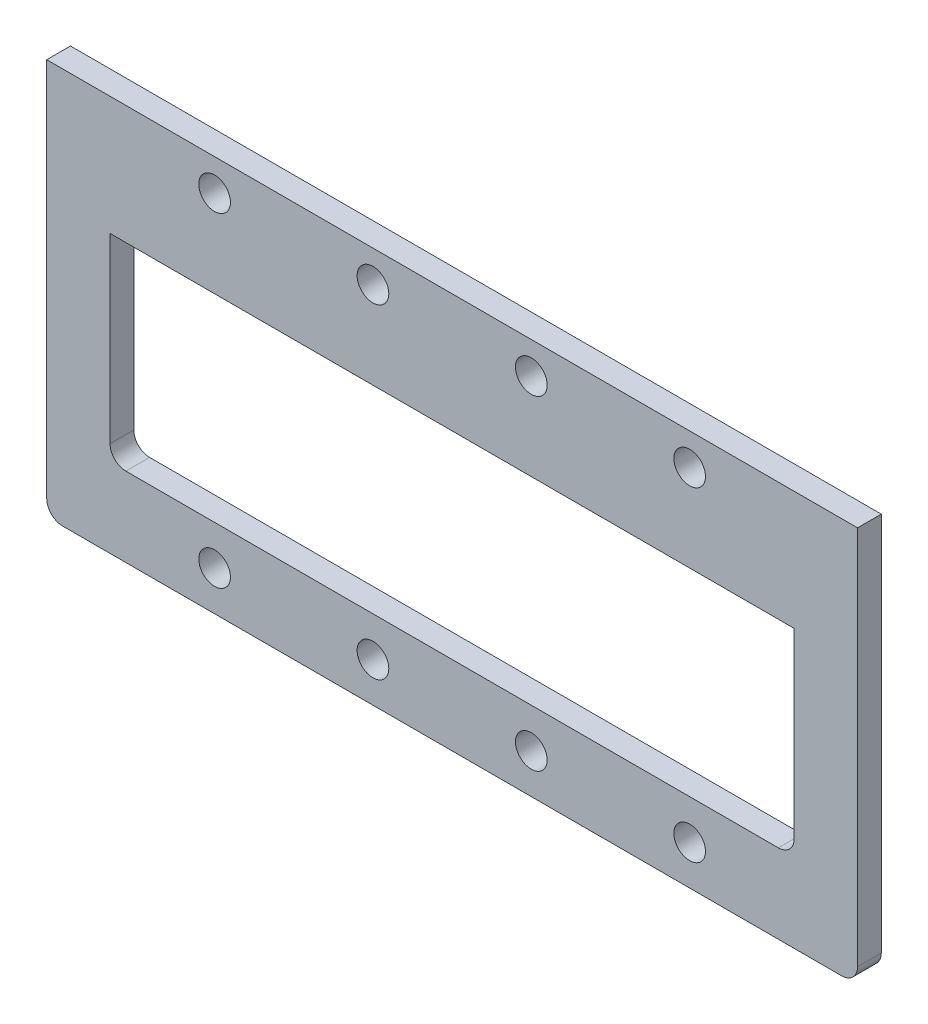
ISO-10303-21;
HEADER;
FILE_DESCRIPTION(('STEP AP214'),'2;1');
FILE_NAME('part.step','',(''),(''),'','','');
FILE_SCHEMA(('AUTOMOTIVE_DESIGN { 1 0 10303 214 1 1 1 1 }'));
ENDSEC;
DATA;
#1=APPLICATION_CONTEXT('core data for automotive mechanical design processes');
#2=APPLICATION_PROTOCOL_DEFINITION('international standard','automotive_design',2000,#1);
#3=PRODUCT_CONTEXT('',#1,'mechanical');
#4=PRODUCT('Part','Part','',(#3));
#5=PRODUCT_RELATED_PRODUCT_CATEGORY('part','',(#4));
#6=PRODUCT_DEFINITION_FORMATION('','',#4);
#7=PRODUCT_DEFINITION_CONTEXT('part definition',#1,'design');
#8=PRODUCT_DEFINITION('design','',#6,#7);
#9=PRODUCT_DEFINITION_SHAPE('','',#8);
#10=(LENGTH_UNIT() NAMED_UNIT(*) SI_UNIT(.MILLI.,.METRE.));
#11=(NAMED_UNIT(*) PLANE_ANGLE_UNIT() SI_UNIT($,.RADIAN.));
#12=(NAMED_UNIT(*) SI_UNIT($,.STERADIAN.) SOLID_ANGLE_UNIT());
#13=UNCERTAINTY_MEASURE_WITH_UNIT(LENGTH_MEASURE(1.E-05),#10,'distance_accuracy_value','');
#14=(GEOMETRIC_REPRESENTATION_CONTEXT(3) GLOBAL_UNCERTAINTY_ASSIGNED_CONTEXT((#13)) GLOBAL_UNIT_ASSIGNED_CONTEXT((#10,
#11,#12)) REPRESENTATION_CONTEXT('',''));
#15=CARTESIAN_POINT('',(0.,0.,0.));
#16=DIRECTION('',(0.,0.,1.));
#17=DIRECTION('',(1.,0.,0.));
#18=AXIS2_PLACEMENT_3D('',#15,#16,#17);
#19=CARTESIAN_POINT('',(0.,0.,3.));
#20=DIRECTION('',(0.,0.,1.));
#21=DIRECTION('',(1.,0.,0.));
#22=AXIS2_PLACEMENT_3D('',#19,#20,#21);
#23=PLANE('',#22);
#24=CARTESIAN_POINT('',(10.5636615811373,20.1545076282941,3.));
#25=DIRECTION('',(0.,0.,1.));
#26=DIRECTION('',(1.,0.,0.));
#27=AXIS2_PLACEMENT_3D('',#24,#25,#26);
#28=CIRCLE('',#27,2.);
#29=CARTESIAN_POINT('',(12.5636615811373,20.1545076282941,3.));
#30=VERTEX_POINT('',#29);
#31=EDGE_CURVE('E157',#30,#30,#28,.T.);
#32=ORIENTED_EDGE('',*,*,#31,.F.);
#33=EDGE_LOOP('',(#32));
#34=FACE_BOUND('',#33,.T.);
#35=CARTESIAN_POINT('',(-9.43633841886271,-20.845492371706,3.));
#36=DIRECTION('',(0.,0.,1.));
#37=DIRECTION('',(1.,0.,0.));
#38=AXIS2_PLACEMENT_3D('',#35,#36,#37);
#39=CIRCLE('',#38,2.);
#40=CARTESIAN_POINT('',(-7.43633841886271,-20.845492371706,3.));
#41=VERTEX_POINT('',#40);
#42=EDGE_CURVE('E237',#41,#41,#39,.T.);
#43=ORIENTED_EDGE('',*,*,#42,.F.);
#44=EDGE_LOOP('',(#43));
#45=FACE_BOUND('',#44,.T.);
#46=CARTESIAN_POINT('',(-9.43633841886271,20.1545076282941,3.));
#47=DIRECTION('',(0.,0.,1.));
#48=DIRECTION('',(1.,0.,0.));
#49=AXIS2_PLACEMENT_3D('',#46,#47,#48);
#50=CIRCLE('',#49,2.);
#51=CARTESIAN_POINT('',(-7.43633841886271,20.1545076282941,3.));
#52=VERTEX_POINT('',#51);
#53=EDGE_CURVE('E240',#52,#52,#50,.T.);
#54=ORIENTED_EDGE('',*,*,#53,.F.);
#55=EDGE_LOOP('',(#54));
#56=FACE_BOUND('',#55,.T.);
#57=CARTESIAN_POINT('',(-29.4363384188627,-20.845492371706,3.));
#58=DIRECTION('',(0.,0.,1.));
#59=DIRECTION('',(1.,0.,0.));
#60=AXIS2_PLACEMENT_3D('',#57,#58,#59);
#61=CIRCLE('',#60,2.);
#62=CARTESIAN_POINT('',(-27.4363384188627,-20.845492371706,3.));
#63=VERTEX_POINT('',#62);
#64=EDGE_CURVE('E243',#63,#63,#61,.T.);
#65=ORIENTED_EDGE('',*,*,#64,.F.);
#66=EDGE_LOOP('',(#65));
#67=FACE_BOUND('',#66,.T.);
#68=CARTESIAN_POINT('',(30.5636615811373,-20.845492371706,3.));
#69=DIRECTION('',(0.,0.,1.));
#70=DIRECTION('',(1.,0.,0.));
#71=AXIS2_PLACEMENT_3D('',#68,#69,#70);
#72=CIRCLE('',#71,2.);
#73=CARTESIAN_POINT('',(32.5636615811373,-20.845492371706,3.));
#74=VERTEX_POINT('',#73);
#75=EDGE_CURVE('E246',#74,#74,#72,.T.);
#76=ORIENTED_EDGE('',*,*,#75,.F.);
#77=EDGE_LOOP('',(#76));
#78=FACE_BOUND('',#77,.T.);
#79=CARTESIAN_POINT('',(30.5636615811373,20.1545076282941,3.));
#80=DIRECTION('',(0.,0.,1.));
#81=DIRECTION('',(1.,0.,0.));
#82=AXIS2_PLACEMENT_3D('',#79,#80,#81);
#83=CIRCLE('',#82,2.);
#84=CARTESIAN_POINT('',(32.5636615811373,20.1545076282941,3.));
#85=VERTEX_POINT('',#84);
#86=EDGE_CURVE('E249',#85,#85,#83,.T.);
#87=ORIENTED_EDGE('',*,*,#86,.F.);
#88=EDGE_LOOP('',(#87));
#89=FACE_BOUND('',#88,.T.);
#90=CARTESIAN_POINT('',(10.5636615811373,-20.845492371706,3.));
#91=DIRECTION('',(0.,0.,1.));
#92=DIRECTION('',(1.,0.,0.));
#93=AXIS2_PLACEMENT_3D('',#90,#91,#92);
#94=CIRCLE('',#93,2.);
#95=CARTESIAN_POINT('',(12.5636615811373,-20.845492371706,3.));
#96=VERTEX_POINT('',#95);
#97=EDGE_CURVE('E252',#96,#96,#94,.T.);
#98=ORIENTED_EDGE('',*,*,#97,.F.);
#99=EDGE_LOOP('',(#98));
#100=FACE_BOUND('',#99,.T.);
#101=CARTESIAN_POINT('',(-29.4363384188627,20.1545076282941,3.));
#102=DIRECTION('',(0.,0.,1.));
#103=DIRECTION('',(1.,0.,0.));
#104=AXIS2_PLACEMENT_3D('',#101,#102,#103);
#105=CIRCLE('',#104,2.);
#106=CARTESIAN_POINT('',(-27.4363384188627,20.1545076282941,3.));
#107=VERTEX_POINT('',#106);
#108=EDGE_CURVE('E255',#107,#107,#105,.T.);
#109=ORIENTED_EDGE('',*,*,#108,.F.);
#110=EDGE_LOOP('',(#109));
#111=FACE_BOUND('',#110,.T.);
#112=DIRECTION('',(0.,-1.,0.));
#113=VECTOR('',#112,1.);
#114=CARTESIAN_POINT('',(-50.6363384188627,24.154507628294,3.));
#115=LINE('',#114,#113);
#116=CARTESIAN_POINT('',(-50.6363384188627,24.154507628294,3.));
#117=VERTEX_POINT('',#116);
#118=CARTESIAN_POINT('',(-50.6363384188627,-23.845492371706,3.));
#119=VERTEX_POINT('',#118);
#120=EDGE_CURVE('E167',#117,#119,#115,.T.);
#121=ORIENTED_EDGE('',*,*,#120,.T.);
#122=CARTESIAN_POINT('',(-48.6363384188627,-23.845492371706,3.));
#123=DIRECTION('',(0.,0.,1.));
#124=DIRECTION('',(1.,0.,0.));
#125=AXIS2_PLACEMENT_3D('',#122,#123,#124);
#126=CIRCLE('',#125,2.);
#127=CARTESIAN_POINT('',(-48.6363384188627,-25.845492371706,3.));
#128=VERTEX_POINT('',#127);
#129=EDGE_CURVE('E208',#119,#128,#126,.T.);
#130=ORIENTED_EDGE('',*,*,#129,.T.);
#131=DIRECTION('',(1.,0.,0.));
#132=VECTOR('',#131,1.);
#133=CARTESIAN_POINT('',(-50.6363384188627,-25.845492371706,3.));
#134=LINE('',#133,#132);
#135=CARTESIAN_POINT('',(49.7636615811375,-25.845492371706,3.));
#136=VERTEX_POINT('',#135);
#137=EDGE_CURVE('E170',#128,#136,#134,.T.);
#138=ORIENTED_EDGE('',*,*,#137,.T.);
#139=CARTESIAN_POINT('',(49.7636615811375,-23.845492371706,3.));
#140=DIRECTION('',(0.,0.,1.));
#141=DIRECTION('',(1.,0.,0.));
#142=AXIS2_PLACEMENT_3D('',#139,#140,#141);
#143=CIRCLE('',#142,2.);
#144=CARTESIAN_POINT('',(51.7636615811373,-23.845492371706,3.));
#145=VERTEX_POINT('',#144);
#146=EDGE_CURVE('E49',#136,#145,#143,.T.);
#147=ORIENTED_EDGE('',*,*,#146,.T.);
#148=DIRECTION('',(0.,1.,0.));
#149=VECTOR('',#148,1.);
#150=CARTESIAN_POINT('',(51.7636615811373,-25.845492371706,3.));
#151=LINE('',#150,#149);
#152=CARTESIAN_POINT('',(51.7636615811373,24.1545076282941,3.));
#153=VERTEX_POINT('',#152);
#154=EDGE_CURVE('E172',#145,#153,#151,.T.);
#155=ORIENTED_EDGE('',*,*,#154,.T.);
#156=DIRECTION('',(-1.,0.,0.));
#157=VECTOR('',#156,1.);
#158=CARTESIAN_POINT('',(51.7636615811373,24.1545076282941,3.));
#159=LINE('',#158,#157);
#160=EDGE_CURVE('E164',#153,#117,#159,.T.);
#161=ORIENTED_EDGE('',*,*,#160,.T.);
#162=EDGE_LOOP('',(#121,#130,#138,#147,#155,#161));
#163=FACE_BOUND('',#162,.T.);
#164=DIRECTION('',(0.,1.,0.));
#165=VECTOR('',#164,1.);
#166=CARTESIAN_POINT('',(43.7636615811373,-15.845492371706,3.));
#167=LINE('',#166,#165);
#168=CARTESIAN_POINT('',(43.7636615811373,-13.845492371706,3.));
#169=VERTEX_POINT('',#168);
#170=CARTESIAN_POINT('',(43.7636615811373,9.15450762829408,3.));
#171=VERTEX_POINT('',#170);
#172=EDGE_CURVE('E124',#169,#171,#167,.T.);
#173=ORIENTED_EDGE('',*,*,#172,.F.);
#174=CARTESIAN_POINT('',(41.7636615811373,-13.845492371706,3.));
#175=DIRECTION('',(0.,0.,1.));
#176=DIRECTION('',(1.,0.,0.));
#177=AXIS2_PLACEMENT_3D('',#174,#175,#176);
#178=CIRCLE('',#177,2.);
#179=CARTESIAN_POINT('',(41.7636615811373,-15.845492371706,3.));
#180=VERTEX_POINT('',#179);
#181=EDGE_CURVE('E215',#169,#180,#178,.F.);
#182=ORIENTED_EDGE('',*,*,#181,.T.);
#183=DIRECTION('',(1.,0.,0.));
#184=VECTOR('',#183,1.);
#185=CARTESIAN_POINT('',(-42.6363384188627,-15.845492371706,3.));
#186=LINE('',#185,#184);
#187=CARTESIAN_POINT('',(-40.6363384188627,-15.845492371706,3.));
#188=VERTEX_POINT('',#187);
#189=EDGE_CURVE('E136',#188,#180,#186,.T.);
#190=ORIENTED_EDGE('',*,*,#189,.F.);
#191=CARTESIAN_POINT('',(-40.6363384188627,-13.845492371706,3.));
#192=DIRECTION('',(0.,0.,1.));
#193=DIRECTION('',(1.,0.,0.));
#194=AXIS2_PLACEMENT_3D('',#191,#192,#193);
#195=CIRCLE('',#194,2.);
#196=CARTESIAN_POINT('',(-42.6363384188627,-13.845492371706,3.));
#197=VERTEX_POINT('',#196);
#198=EDGE_CURVE('E11',#188,#197,#195,.F.);
#199=ORIENTED_EDGE('',*,*,#198,.T.);
#200=DIRECTION('',(0.,-1.,0.));
#201=VECTOR('',#200,1.);
#202=CARTESIAN_POINT('',(-42.6363384188627,9.15450762829408,3.));
#203=LINE('',#202,#201);
#204=CARTESIAN_POINT('',(-42.6363384188627,9.15450762829408,3.));
#205=VERTEX_POINT('',#204);
#206=EDGE_CURVE('E148',#205,#197,#203,.T.);
#207=ORIENTED_EDGE('',*,*,#206,.F.);
#208=DIRECTION('',(-1.,0.,0.));
#209=VECTOR('',#208,1.);
#210=CARTESIAN_POINT('',(43.7636615811373,9.15450762829408,3.));
#211=LINE('',#210,#209);
#212=EDGE_CURVE('E135',#171,#205,#211,.T.);
#213=ORIENTED_EDGE('',*,*,#212,.F.);
#214=EDGE_LOOP('',(#173,#182,#190,#199,#207,#213));
#215=FACE_BOUND('',#214,.T.);
#216=ADVANCED_FACE('F34',(#34,#45,#56,#67,#78,#89,#100,#111,#163,#215),#23,.T.);
#217=CARTESIAN_POINT('',(0.,0.,0.));
#218=DIRECTION('',(0.,0.,1.));
#219=DIRECTION('',(1.,0.,0.));
#220=AXIS2_PLACEMENT_3D('',#217,#218,#219);
#221=PLANE('',#220);
#222=CARTESIAN_POINT('',(10.5636615811373,20.1545076282941,0.));
#223=DIRECTION('',(0.,0.,1.));
#224=DIRECTION('',(1.,0.,0.));
#225=AXIS2_PLACEMENT_3D('',#222,#223,#224);
#226=CIRCLE('',#225,2.);
#227=CARTESIAN_POINT('',(12.5636615811373,20.1545076282941,0.));
#228=VERTEX_POINT('',#227);
#229=EDGE_CURVE('E268',#228,#228,#226,.T.);
#230=ORIENTED_EDGE('',*,*,#229,.T.);
#231=EDGE_LOOP('',(#230));
#232=FACE_BOUND('',#231,.T.);
#233=CARTESIAN_POINT('',(-9.43633841886271,-20.845492371706,0.));
#234=DIRECTION('',(0.,0.,1.));
#235=DIRECTION('',(1.,0.,0.));
#236=AXIS2_PLACEMENT_3D('',#233,#234,#235);
#237=CIRCLE('',#236,2.);
#238=CARTESIAN_POINT('',(-7.43633841886271,-20.845492371706,0.));
#239=VERTEX_POINT('',#238);
#240=EDGE_CURVE('E265',#239,#239,#237,.T.);
#241=ORIENTED_EDGE('',*,*,#240,.T.);
#242=EDGE_LOOP('',(#241));
#243=FACE_BOUND('',#242,.T.);
#244=CARTESIAN_POINT('',(-9.43633841886271,20.1545076282941,0.));
#245=DIRECTION('',(0.,0.,1.));
#246=DIRECTION('',(1.,0.,0.));
#247=AXIS2_PLACEMENT_3D('',#244,#245,#246);
#248=CIRCLE('',#247,2.);
#249=CARTESIAN_POINT('',(-7.43633841886271,20.1545076282941,0.));
#250=VERTEX_POINT('',#249);
#251=EDGE_CURVE('E262',#250,#250,#248,.T.);
#252=ORIENTED_EDGE('',*,*,#251,.T.);
#253=EDGE_LOOP('',(#252));
#254=FACE_BOUND('',#253,.T.);
#255=CARTESIAN_POINT('',(-29.4363384188627,-20.845492371706,0.));
#256=DIRECTION('',(0.,0.,1.));
#257=DIRECTION('',(1.,0.,0.));
#258=AXIS2_PLACEMENT_3D('',#255,#256,#257);
#259=CIRCLE('',#258,2.);
#260=CARTESIAN_POINT('',(-27.4363384188627,-20.845492371706,0.));
#261=VERTEX_POINT('',#260);
#262=EDGE_CURVE('E261',#261,#261,#259,.T.);
#263=ORIENTED_EDGE('',*,*,#262,.T.);
#264=EDGE_LOOP('',(#263));
#265=FACE_BOUND('',#264,.T.);
#266=CARTESIAN_POINT('',(30.5636615811373,-20.845492371706,0.));
#267=DIRECTION('',(0.,0.,1.));
#268=DIRECTION('',(1.,0.,0.));
#269=AXIS2_PLACEMENT_3D('',#266,#267,#268);
#270=CIRCLE('',#269,2.);
#271=CARTESIAN_POINT('',(32.5636615811373,-20.845492371706,0.));
#272=VERTEX_POINT('',#271);
#273=EDGE_CURVE('E277',#272,#272,#270,.T.);
#274=ORIENTED_EDGE('',*,*,#273,.T.);
#275=EDGE_LOOP('',(#274));
#276=FACE_BOUND('',#275,.T.);
#277=CARTESIAN_POINT('',(30.5636615811373,20.1545076282941,0.));
#278=DIRECTION('',(0.,0.,1.));
#279=DIRECTION('',(1.,0.,0.));
#280=AXIS2_PLACEMENT_3D('',#277,#278,#279);
#281=CIRCLE('',#280,2.);
#282=CARTESIAN_POINT('',(32.5636615811373,20.1545076282941,0.));
#283=VERTEX_POINT('',#282);
#284=EDGE_CURVE('E274',#283,#283,#281,.T.);
#285=ORIENTED_EDGE('',*,*,#284,.T.);
#286=EDGE_LOOP('',(#285));
#287=FACE_BOUND('',#286,.T.);
#288=CARTESIAN_POINT('',(10.5636615811373,-20.845492371706,0.));
#289=DIRECTION('',(0.,0.,1.));
#290=DIRECTION('',(1.,0.,0.));
#291=AXIS2_PLACEMENT_3D('',#288,#289,#290);
#292=CIRCLE('',#291,2.);
#293=CARTESIAN_POINT('',(12.5636615811373,-20.845492371706,0.));
#294=VERTEX_POINT('',#293);
#295=EDGE_CURVE('E271',#294,#294,#292,.T.);
#296=ORIENTED_EDGE('',*,*,#295,.T.);
#297=EDGE_LOOP('',(#296));
#298=FACE_BOUND('',#297,.T.);
#299=CARTESIAN_POINT('',(-29.4363384188627,20.1545076282941,0.));
#300=DIRECTION('',(0.,0.,1.));
#301=DIRECTION('',(1.,0.,0.));
#302=AXIS2_PLACEMENT_3D('',#299,#300,#301);
#303=CIRCLE('',#302,2.);
#304=CARTESIAN_POINT('',(-27.4363384188627,20.1545076282941,0.));
#305=VERTEX_POINT('',#304);
#306=EDGE_CURVE('E258',#305,#305,#303,.T.);
#307=ORIENTED_EDGE('',*,*,#306,.T.);
#308=EDGE_LOOP('',(#307));
#309=FACE_BOUND('',#308,.T.);
#310=DIRECTION('',(1.,0.,0.));
#311=VECTOR('',#310,1.);
#312=CARTESIAN_POINT('',(-50.6363384188627,-25.845492371706,0.));
#313=LINE('',#312,#311);
#314=CARTESIAN_POINT('',(-48.6363384188627,-25.845492371706,0.));
#315=VERTEX_POINT('',#314);
#316=CARTESIAN_POINT('',(49.7636615811375,-25.845492371706,0.));
#317=VERTEX_POINT('',#316);
#318=EDGE_CURVE('E179',#315,#317,#313,.T.);
#319=ORIENTED_EDGE('',*,*,#318,.F.);
#320=CARTESIAN_POINT('',(-48.6363384188627,-23.845492371706,0.));
#321=DIRECTION('',(0.,0.,1.));
#322=DIRECTION('',(1.,0.,0.));
#323=AXIS2_PLACEMENT_3D('',#320,#321,#322);
#324=CIRCLE('',#323,2.);
#325=CARTESIAN_POINT('',(-50.6363384188627,-23.845492371706,0.));
#326=VERTEX_POINT('',#325);
#327=EDGE_CURVE('E204',#315,#326,#324,.F.);
#328=ORIENTED_EDGE('',*,*,#327,.T.);
#329=DIRECTION('',(0.,-1.,0.));
#330=VECTOR('',#329,1.);
#331=CARTESIAN_POINT('',(-50.6363384188627,16.1545076282941,0.));
#332=LINE('',#331,#330);
#333=CARTESIAN_POINT('',(-50.6363384188627,24.154507628294,0.));
#334=VERTEX_POINT('',#333);
#335=EDGE_CURVE('E177',#334,#326,#332,.T.);
#336=ORIENTED_EDGE('',*,*,#335,.F.);
#337=DIRECTION('',(-1.,0.,0.));
#338=VECTOR('',#337,1.);
#339=CARTESIAN_POINT('',(51.7636615811373,24.1545076282941,0.));
#340=LINE('',#339,#338);
#341=CARTESIAN_POINT('',(51.7636615811373,24.1545076282941,0.));
#342=VERTEX_POINT('',#341);
#343=EDGE_CURVE('E144',#342,#334,#340,.T.);
#344=ORIENTED_EDGE('',*,*,#343,.F.);
#345=DIRECTION('',(0.,1.,0.));
#346=VECTOR('',#345,1.);
#347=CARTESIAN_POINT('',(51.7636615811373,18.1545076282941,0.));
#348=LINE('',#347,#346);
#349=CARTESIAN_POINT('',(51.7636615811375,-23.845492371706,0.));
#350=VERTEX_POINT('',#349);
#351=EDGE_CURVE('E168',#350,#342,#348,.T.);
#352=ORIENTED_EDGE('',*,*,#351,.F.);
#353=CARTESIAN_POINT('',(49.7636615811375,-23.845492371706,0.));
#354=DIRECTION('',(0.,0.,1.));
#355=DIRECTION('',(1.,0.,0.));
#356=AXIS2_PLACEMENT_3D('',#353,#354,#355);
#357=CIRCLE('',#356,2.);
#358=EDGE_CURVE('E202',#350,#317,#357,.F.);
#359=ORIENTED_EDGE('',*,*,#358,.T.);
#360=EDGE_LOOP('',(#319,#328,#336,#344,#352,#359));
#361=FACE_BOUND('',#360,.T.);
#362=DIRECTION('',(0.,-1.,0.));
#363=VECTOR('',#362,1.);
#364=CARTESIAN_POINT('',(-42.6363384188627,9.15450762829408,0.));
#365=LINE('',#364,#363);
#366=CARTESIAN_POINT('',(-42.6363384188627,9.15450762829408,0.));
#367=VERTEX_POINT('',#366);
#368=CARTESIAN_POINT('',(-42.6363384188627,-13.845492371706,0.));
#369=VERTEX_POINT('',#368);
#370=EDGE_CURVE('E160',#367,#369,#365,.T.);
#371=ORIENTED_EDGE('',*,*,#370,.T.);
#372=CARTESIAN_POINT('',(-40.6363384188627,-13.845492371706,0.));
#373=DIRECTION('',(0.,0.,1.));
#374=DIRECTION('',(1.,0.,0.));
#375=AXIS2_PLACEMENT_3D('',#372,#373,#374);
#376=CIRCLE('',#375,2.);
#377=CARTESIAN_POINT('',(-40.6363384188627,-15.845492371706,0.));
#378=VERTEX_POINT('',#377);
#379=EDGE_CURVE('E42',#369,#378,#376,.T.);
#380=ORIENTED_EDGE('',*,*,#379,.T.);
#381=DIRECTION('',(1.,0.,0.));
#382=VECTOR('',#381,1.);
#383=CARTESIAN_POINT('',(-42.6363384188627,-15.845492371706,0.));
#384=LINE('',#383,#382);
#385=CARTESIAN_POINT('',(41.7636615811373,-15.845492371706,0.));
#386=VERTEX_POINT('',#385);
#387=EDGE_CURVE('E153',#378,#386,#384,.T.);
#388=ORIENTED_EDGE('',*,*,#387,.T.);
#389=CARTESIAN_POINT('',(41.7636615811373,-13.845492371706,0.));
#390=DIRECTION('',(0.,0.,1.));
#391=DIRECTION('',(1.,0.,0.));
#392=AXIS2_PLACEMENT_3D('',#389,#390,#391);
#393=CIRCLE('',#392,2.);
#394=CARTESIAN_POINT('',(43.7636615811373,-13.845492371706,0.));
#395=VERTEX_POINT('',#394);
#396=EDGE_CURVE('E213',#386,#395,#393,.T.);
#397=ORIENTED_EDGE('',*,*,#396,.T.);
#398=DIRECTION('',(0.,1.,0.));
#399=VECTOR('',#398,1.);
#400=CARTESIAN_POINT('',(43.7636615811373,-15.845492371706,0.));
#401=LINE('',#400,#399);
#402=CARTESIAN_POINT('',(43.7636615811373,9.15450762829408,0.));
#403=VERTEX_POINT('',#402);
#404=EDGE_CURVE('E156',#395,#403,#401,.T.);
#405=ORIENTED_EDGE('',*,*,#404,.T.);
#406=DIRECTION('',(-1.,0.,0.));
#407=VECTOR('',#406,1.);
#408=CARTESIAN_POINT('',(43.7636615811373,9.15450762829408,0.));
#409=LINE('',#408,#407);
#410=EDGE_CURVE('E143',#403,#367,#409,.T.);
#411=ORIENTED_EDGE('',*,*,#410,.T.);
#412=EDGE_LOOP('',(#371,#380,#388,#397,#405,#411));
#413=FACE_BOUND('',#412,.T.);
#414=ADVANCED_FACE('F218',(#232,#243,#254,#265,#276,#287,#298,#309,#361,#413),#221,.F.);
#415=CARTESIAN_POINT('',(51.7636615811373,24.1545076282941,3.));
#416=DIRECTION('',(0.,-1.,0.));
#417=DIRECTION('',(1.,0.,0.));
#418=AXIS2_PLACEMENT_3D('',#415,#416,#417);
#419=PLANE('',#418);
#420=ORIENTED_EDGE('',*,*,#343,.T.);
#421=DIRECTION('',(0.,0.,-1.));
#422=VECTOR('',#421,1.);
#423=CARTESIAN_POINT('',(-50.6363384188627,24.154507628294,3.));
#424=LINE('',#423,#422);
#425=EDGE_CURVE('E185',#117,#334,#424,.T.);
#426=ORIENTED_EDGE('',*,*,#425,.F.);
#427=ORIENTED_EDGE('',*,*,#160,.F.);
#428=DIRECTION('',(0.,0.,-1.));
#429=VECTOR('',#428,1.);
#430=CARTESIAN_POINT('',(51.7636615811373,24.1545076282941,3.));
#431=LINE('',#430,#429);
#432=EDGE_CURVE('E174',#153,#342,#431,.T.);
#433=ORIENTED_EDGE('',*,*,#432,.T.);
#434=EDGE_LOOP('',(#420,#426,#427,#433));
#435=FACE_BOUND('',#434,.T.);
#436=ADVANCED_FACE('F308',(#435),#419,.F.);
#437=CARTESIAN_POINT('',(-50.6363384188627,16.1545076282941,3.));
#438=DIRECTION('',(1.,0.,0.));
#439=DIRECTION('',(0.,0.,-1.));
#440=AXIS2_PLACEMENT_3D('',#437,#438,#439);
#441=PLANE('',#440);
#442=ORIENTED_EDGE('',*,*,#335,.T.);
#443=DIRECTION('',(0.,0.,-1.));
#444=VECTOR('',#443,1.);
#445=CARTESIAN_POINT('',(-50.6363384188627,-23.845492371706,3.));
#446=LINE('',#445,#444);
#447=EDGE_CURVE('E57',#326,#119,#446,.F.);
#448=ORIENTED_EDGE('',*,*,#447,.T.);
#449=ORIENTED_EDGE('',*,*,#120,.F.);
#450=ORIENTED_EDGE('',*,*,#425,.T.);
#451=EDGE_LOOP('',(#442,#448,#449,#450));
#452=FACE_BOUND('',#451,.T.);
#453=ADVANCED_FACE('F323',(#452),#441,.F.);
#454=CARTESIAN_POINT('',(-50.6363384188627,-25.845492371706,3.));
#455=DIRECTION('',(0.,1.,0.));
#456=DIRECTION('',(0.,0.,1.));
#457=AXIS2_PLACEMENT_3D('',#454,#455,#456);
#458=PLANE('',#457);
#459=ORIENTED_EDGE('',*,*,#137,.F.);
#460=DIRECTION('',(0.,0.,-1.));
#461=VECTOR('',#460,1.);
#462=CARTESIAN_POINT('',(-48.6363384188627,-25.845492371706,3.));
#463=LINE('',#462,#461);
#464=EDGE_CURVE('E199',#128,#315,#463,.T.);
#465=ORIENTED_EDGE('',*,*,#464,.T.);
#466=ORIENTED_EDGE('',*,*,#318,.T.);
#467=DIRECTION('',(0.,0.,-1.));
#468=VECTOR('',#467,1.);
#469=CARTESIAN_POINT('',(49.7636615811375,-25.845492371706,3.));
#470=LINE('',#469,#468);
#471=EDGE_CURVE('E197',#317,#136,#470,.F.);
#472=ORIENTED_EDGE('',*,*,#471,.T.);
#473=EDGE_LOOP('',(#459,#465,#466,#472));
#474=FACE_BOUND('',#473,.T.);
#475=ADVANCED_FACE('F319',(#474),#458,.F.);
#476=CARTESIAN_POINT('',(51.7636615811373,18.1545076282941,3.));
#477=DIRECTION('',(-1.,0.,0.));
#478=DIRECTION('',(0.,-1.,0.));
#479=AXIS2_PLACEMENT_3D('',#476,#477,#478);
#480=PLANE('',#479);
#481=ORIENTED_EDGE('',*,*,#154,.F.);
#482=DIRECTION('',(0.,0.,-1.));
#483=VECTOR('',#482,1.);
#484=CARTESIAN_POINT('',(51.7636615811375,-23.845492371706,3.));
#485=LINE('',#484,#483);
#486=EDGE_CURVE('E210',#145,#350,#485,.T.);
#487=ORIENTED_EDGE('',*,*,#486,.T.);
#488=ORIENTED_EDGE('',*,*,#351,.T.);
#489=ORIENTED_EDGE('',*,*,#432,.F.);
#490=EDGE_LOOP('',(#481,#487,#488,#489));
#491=FACE_BOUND('',#490,.T.);
#492=ADVANCED_FACE('F316',(#491),#480,.F.);
#493=CARTESIAN_POINT('',(-42.6363384188627,-15.845492371706,3.));
#494=DIRECTION('',(0.,1.,0.));
#495=DIRECTION('',(0.,0.,1.));
#496=AXIS2_PLACEMENT_3D('',#493,#494,#495);
#497=PLANE('',#496);
#498=ORIENTED_EDGE('',*,*,#189,.T.);
#499=DIRECTION('',(0.,0.,-1.));
#500=VECTOR('',#499,1.);
#501=CARTESIAN_POINT('',(41.7636615811373,-15.845492371706,0.));
#502=LINE('',#501,#500);
#503=EDGE_CURVE('E190',#180,#386,#502,.T.);
#504=ORIENTED_EDGE('',*,*,#503,.T.);
#505=ORIENTED_EDGE('',*,*,#387,.F.);
#506=DIRECTION('',(0.,0.,-1.));
#507=VECTOR('',#506,1.);
#508=CARTESIAN_POINT('',(-40.6363384188627,-15.845492371706,3.));
#509=LINE('',#508,#507);
#510=EDGE_CURVE('E188',#378,#188,#509,.F.);
#511=ORIENTED_EDGE('',*,*,#510,.T.);
#512=EDGE_LOOP('',(#498,#504,#505,#511));
#513=FACE_BOUND('',#512,.T.);
#514=ADVANCED_FACE('F225',(#513),#497,.T.);
#515=CARTESIAN_POINT('',(43.7636615811373,-15.845492371706,3.));
#516=DIRECTION('',(-1.,0.,0.));
#517=DIRECTION('',(0.,-1.,0.));
#518=AXIS2_PLACEMENT_3D('',#515,#516,#517);
#519=PLANE('',#518);
#520=ORIENTED_EDGE('',*,*,#404,.F.);
#521=DIRECTION('',(0.,0.,-1.));
#522=VECTOR('',#521,1.);
#523=CARTESIAN_POINT('',(43.7636615811373,-13.845492371706,3.));
#524=LINE('',#523,#522);
#525=EDGE_CURVE('E131',#395,#169,#524,.F.);
#526=ORIENTED_EDGE('',*,*,#525,.T.);
#527=ORIENTED_EDGE('',*,*,#172,.T.);
#528=DIRECTION('',(0.,0.,-1.));
#529=VECTOR('',#528,1.);
#530=CARTESIAN_POINT('',(43.7636615811373,9.15450762829408,3.));
#531=LINE('',#530,#529);
#532=EDGE_CURVE('E128',#171,#403,#531,.T.);
#533=ORIENTED_EDGE('',*,*,#532,.T.);
#534=EDGE_LOOP('',(#520,#526,#527,#533));
#535=FACE_BOUND('',#534,.T.);
#536=ADVANCED_FACE('F127',(#535),#519,.T.);
#537=CARTESIAN_POINT('',(43.7636615811373,9.15450762829408,3.));
#538=DIRECTION('',(0.,-1.,0.));
#539=DIRECTION('',(0.,0.,-1.));
#540=AXIS2_PLACEMENT_3D('',#537,#538,#539);
#541=PLANE('',#540);
#542=ORIENTED_EDGE('',*,*,#410,.F.);
#543=ORIENTED_EDGE('',*,*,#532,.F.);
#544=ORIENTED_EDGE('',*,*,#212,.T.);
#545=DIRECTION('',(0.,0.,-1.));
#546=VECTOR('',#545,1.);
#547=CARTESIAN_POINT('',(-42.6363384188627,9.15450762829408,3.));
#548=LINE('',#547,#546);
#549=EDGE_CURVE('E145',#205,#367,#548,.T.);
#550=ORIENTED_EDGE('',*,*,#549,.T.);
#551=EDGE_LOOP('',(#542,#543,#544,#550));
#552=FACE_BOUND('',#551,.T.);
#553=ADVANCED_FACE('F140',(#552),#541,.T.);
#554=CARTESIAN_POINT('',(-42.6363384188627,9.15450762829408,3.));
#555=DIRECTION('',(1.,0.,0.));
#556=DIRECTION('',(0.,0.,-1.));
#557=AXIS2_PLACEMENT_3D('',#554,#555,#556);
#558=PLANE('',#557);
#559=ORIENTED_EDGE('',*,*,#206,.T.);
#560=DIRECTION('',(0.,0.,-1.));
#561=VECTOR('',#560,1.);
#562=CARTESIAN_POINT('',(-42.6363384188627,-13.845492371706,0.));
#563=LINE('',#562,#561);
#564=EDGE_CURVE('E194',#197,#369,#563,.T.);
#565=ORIENTED_EDGE('',*,*,#564,.T.);
#566=ORIENTED_EDGE('',*,*,#370,.F.);
#567=ORIENTED_EDGE('',*,*,#549,.F.);
#568=EDGE_LOOP('',(#559,#565,#566,#567));
#569=FACE_BOUND('',#568,.T.);
#570=ADVANCED_FACE('F231',(#569),#558,.T.);
#571=CARTESIAN_POINT('',(-29.4363384188627,20.1545076282941,0.));
#572=DIRECTION('',(0.,0.,1.));
#573=DIRECTION('',(1.,0.,0.));
#574=AXIS2_PLACEMENT_3D('',#571,#572,#573);
#575=CYLINDRICAL_SURFACE('',#574,2.);
#576=ORIENTED_EDGE('',*,*,#108,.T.);
#577=EDGE_LOOP('',(#576));
#578=FACE_BOUND('',#577,.T.);
#579=ORIENTED_EDGE('',*,*,#306,.F.);
#580=EDGE_LOOP('',(#579));
#581=FACE_BOUND('',#580,.T.);
#582=ADVANCED_FACE('F382',(#578,#581),#575,.F.);
#583=CARTESIAN_POINT('',(10.5636615811373,-20.845492371706,0.));
#584=DIRECTION('',(0.,0.,1.));
#585=DIRECTION('',(1.,0.,0.));
#586=AXIS2_PLACEMENT_3D('',#583,#584,#585);
#587=CYLINDRICAL_SURFACE('',#586,2.);
#588=ORIENTED_EDGE('',*,*,#97,.T.);
#589=EDGE_LOOP('',(#588));
#590=FACE_BOUND('',#589,.T.);
#591=ORIENTED_EDGE('',*,*,#295,.F.);
#592=EDGE_LOOP('',(#591));
#593=FACE_BOUND('',#592,.T.);
#594=ADVANCED_FACE('F298',(#590,#593),#587,.F.);
#595=CARTESIAN_POINT('',(30.5636615811373,20.1545076282941,0.));
#596=DIRECTION('',(0.,0.,1.));
#597=DIRECTION('',(1.,0.,0.));
#598=AXIS2_PLACEMENT_3D('',#595,#596,#597);
#599=CYLINDRICAL_SURFACE('',#598,2.);
#600=ORIENTED_EDGE('',*,*,#86,.T.);
#601=EDGE_LOOP('',(#600));
#602=FACE_BOUND('',#601,.T.);
#603=ORIENTED_EDGE('',*,*,#284,.F.);
#604=EDGE_LOOP('',(#603));
#605=FACE_BOUND('',#604,.T.);
#606=ADVANCED_FACE('F288',(#602,#605),#599,.F.);
#607=CARTESIAN_POINT('',(30.5636615811373,-20.845492371706,0.));
#608=DIRECTION('',(0.,0.,1.));
#609=DIRECTION('',(1.,0.,0.));
#610=AXIS2_PLACEMENT_3D('',#607,#608,#609);
#611=CYLINDRICAL_SURFACE('',#610,2.);
#612=ORIENTED_EDGE('',*,*,#75,.T.);
#613=EDGE_LOOP('',(#612));
#614=FACE_BOUND('',#613,.T.);
#615=ORIENTED_EDGE('',*,*,#273,.F.);
#616=EDGE_LOOP('',(#615));
#617=FACE_BOUND('',#616,.T.);
#618=ADVANCED_FACE('F285',(#614,#617),#611,.F.);
#619=CARTESIAN_POINT('',(-29.4363384188627,-20.845492371706,0.));
#620=DIRECTION('',(0.,0.,1.));
#621=DIRECTION('',(1.,0.,0.));
#622=AXIS2_PLACEMENT_3D('',#619,#620,#621);
#623=CYLINDRICAL_SURFACE('',#622,2.);
#624=ORIENTED_EDGE('',*,*,#64,.T.);
#625=EDGE_LOOP('',(#624));
#626=FACE_BOUND('',#625,.T.);
#627=ORIENTED_EDGE('',*,*,#262,.F.);
#628=EDGE_LOOP('',(#627));
#629=FACE_BOUND('',#628,.T.);
#630=ADVANCED_FACE('F287',(#626,#629),#623,.F.);
#631=CARTESIAN_POINT('',(-9.43633841886271,20.1545076282941,0.));
#632=DIRECTION('',(0.,0.,1.));
#633=DIRECTION('',(1.,0.,0.));
#634=AXIS2_PLACEMENT_3D('',#631,#632,#633);
#635=CYLINDRICAL_SURFACE('',#634,2.);
#636=ORIENTED_EDGE('',*,*,#53,.T.);
#637=EDGE_LOOP('',(#636));
#638=FACE_BOUND('',#637,.T.);
#639=ORIENTED_EDGE('',*,*,#251,.F.);
#640=EDGE_LOOP('',(#639));
#641=FACE_BOUND('',#640,.T.);
#642=ADVANCED_FACE('F295',(#638,#641),#635,.F.);
#643=CARTESIAN_POINT('',(-9.43633841886271,-20.845492371706,0.));
#644=DIRECTION('',(0.,0.,1.));
#645=DIRECTION('',(1.,0.,0.));
#646=AXIS2_PLACEMENT_3D('',#643,#644,#645);
#647=CYLINDRICAL_SURFACE('',#646,2.);
#648=ORIENTED_EDGE('',*,*,#42,.T.);
#649=EDGE_LOOP('',(#648));
#650=FACE_BOUND('',#649,.T.);
#651=ORIENTED_EDGE('',*,*,#240,.F.);
#652=EDGE_LOOP('',(#651));
#653=FACE_BOUND('',#652,.T.);
#654=ADVANCED_FACE('F439',(#650,#653),#647,.F.);
#655=CARTESIAN_POINT('',(10.5636615811373,20.1545076282941,0.));
#656=DIRECTION('',(0.,0.,1.));
#657=DIRECTION('',(1.,0.,0.));
#658=AXIS2_PLACEMENT_3D('',#655,#656,#657);
#659=CYLINDRICAL_SURFACE('',#658,2.);
#660=ORIENTED_EDGE('',*,*,#31,.T.);
#661=EDGE_LOOP('',(#660));
#662=FACE_BOUND('',#661,.T.);
#663=ORIENTED_EDGE('',*,*,#229,.F.);
#664=EDGE_LOOP('',(#663));
#665=FACE_BOUND('',#664,.T.);
#666=ADVANCED_FACE('F332',(#662,#665),#659,.F.);
#667=CARTESIAN_POINT('',(41.7636615811373,-13.845492371706,3.));
#668=DIRECTION('',(0.,0.,1.));
#669=DIRECTION('',(1.,0.,0.));
#670=AXIS2_PLACEMENT_3D('',#667,#668,#669);
#671=CYLINDRICAL_SURFACE('',#670,2.);
#672=ORIENTED_EDGE('',*,*,#181,.F.);
#673=ORIENTED_EDGE('',*,*,#525,.F.);
#674=ORIENTED_EDGE('',*,*,#396,.F.);
#675=ORIENTED_EDGE('',*,*,#503,.F.);
#676=EDGE_LOOP('',(#672,#673,#674,#675));
#677=FACE_BOUND('',#676,.T.);
#678=ADVANCED_FACE('F233',(#677),#671,.F.);
#679=CARTESIAN_POINT('',(-40.6363384188627,-13.845492371706,3.));
#680=DIRECTION('',(0.,0.,1.));
#681=DIRECTION('',(1.,0.,0.));
#682=AXIS2_PLACEMENT_3D('',#679,#680,#681);
#683=CYLINDRICAL_SURFACE('',#682,2.);
#684=ORIENTED_EDGE('',*,*,#198,.F.);
#685=ORIENTED_EDGE('',*,*,#510,.F.);
#686=ORIENTED_EDGE('',*,*,#379,.F.);
#687=ORIENTED_EDGE('',*,*,#564,.F.);
#688=EDGE_LOOP('',(#684,#685,#686,#687));
#689=FACE_BOUND('',#688,.T.);
#690=ADVANCED_FACE('F229',(#689),#683,.F.);
#691=CARTESIAN_POINT('',(-48.6363384188627,-23.845492371706,3.));
#692=DIRECTION('',(0.,0.,-1.));
#693=DIRECTION('',(-1.,0.,0.));
#694=AXIS2_PLACEMENT_3D('',#691,#692,#693);
#695=CYLINDRICAL_SURFACE('',#694,2.);
#696=ORIENTED_EDGE('',*,*,#129,.F.);
#697=ORIENTED_EDGE('',*,*,#447,.F.);
#698=ORIENTED_EDGE('',*,*,#327,.F.);
#699=ORIENTED_EDGE('',*,*,#464,.F.);
#700=EDGE_LOOP('',(#696,#697,#698,#699));
#701=FACE_BOUND('',#700,.T.);
#702=ADVANCED_FACE('F334',(#701),#695,.T.);
#703=CARTESIAN_POINT('',(49.7636615811375,-23.845492371706,3.));
#704=DIRECTION('',(0.,0.,-1.));
#705=DIRECTION('',(-1.,0.,0.));
#706=AXIS2_PLACEMENT_3D('',#703,#704,#705);
#707=CYLINDRICAL_SURFACE('',#706,2.);
#708=ORIENTED_EDGE('',*,*,#146,.F.);
#709=ORIENTED_EDGE('',*,*,#471,.F.);
#710=ORIENTED_EDGE('',*,*,#358,.F.);
#711=ORIENTED_EDGE('',*,*,#486,.F.);
#712=EDGE_LOOP('',(#708,#709,#710,#711));
#713=FACE_BOUND('',#712,.T.);
#714=ADVANCED_FACE('F36',(#713),#707,.T.);
#715=CLOSED_SHELL('',(#216,#414,#436,#453,#475,#492,#514,#536,#553,#570,#582,#594,#606,#618,
#630,#642,#654,#666,#678,#690,#702,#714));
#716=MANIFOLD_SOLID_BREP('B2',#715);
#717=ADVANCED_BREP_SHAPE_REPRESENTATION('',(#18,#716),#14);
#718=SHAPE_DEFINITION_REPRESENTATION(#9,#717);
ENDSEC;
END-ISO-10303-21;
